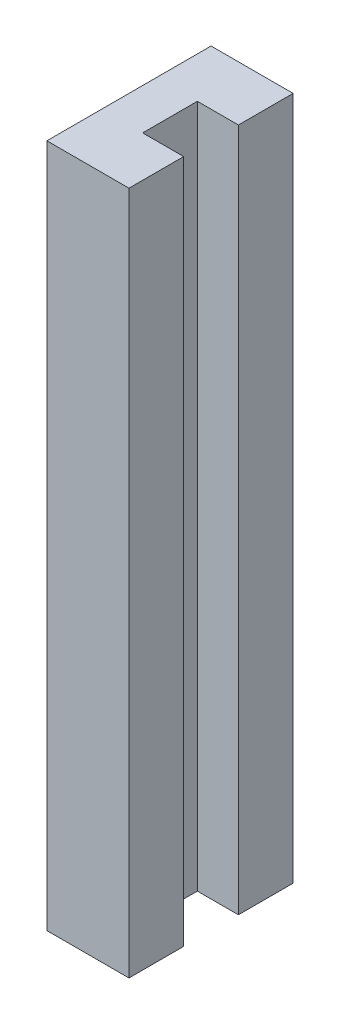
ISO-10303-21;
HEADER;
FILE_DESCRIPTION(('STEP AP214'),'2;1');
FILE_NAME('part.step','',(''),(''),'','','');
FILE_SCHEMA(('AUTOMOTIVE_DESIGN { 1 0 10303 214 1 1 1 1 }'));
ENDSEC;
DATA;
#1=APPLICATION_CONTEXT('core data for automotive mechanical design processes');
#2=APPLICATION_PROTOCOL_DEFINITION('international standard','automotive_design',2000,#1);
#3=PRODUCT_CONTEXT('',#1,'mechanical');
#4=PRODUCT('Part','Part','',(#3));
#5=PRODUCT_RELATED_PRODUCT_CATEGORY('part','',(#4));
#6=PRODUCT_DEFINITION_FORMATION('','',#4);
#7=PRODUCT_DEFINITION_CONTEXT('part definition',#1,'design');
#8=PRODUCT_DEFINITION('design','',#6,#7);
#9=PRODUCT_DEFINITION_SHAPE('','',#8);
#10=(LENGTH_UNIT() NAMED_UNIT(*) SI_UNIT(.MILLI.,.METRE.));
#11=(NAMED_UNIT(*) PLANE_ANGLE_UNIT() SI_UNIT($,.RADIAN.));
#12=(NAMED_UNIT(*) SI_UNIT($,.STERADIAN.) SOLID_ANGLE_UNIT());
#13=UNCERTAINTY_MEASURE_WITH_UNIT(LENGTH_MEASURE(1.E-05),#10,'distance_accuracy_value','');
#14=(GEOMETRIC_REPRESENTATION_CONTEXT(3) GLOBAL_UNCERTAINTY_ASSIGNED_CONTEXT((#13)) GLOBAL_UNIT_ASSIGNED_CONTEXT((#10,
#11,#12)) REPRESENTATION_CONTEXT('',''));
#15=CARTESIAN_POINT('',(0.,0.,0.));
#16=DIRECTION('',(0.,0.,1.));
#17=DIRECTION('',(1.,0.,0.));
#18=AXIS2_PLACEMENT_3D('',#15,#16,#17);
#19=CARTESIAN_POINT('',(0.,50.,0.));
#20=DIRECTION('',(0.,0.,1.));
#21=DIRECTION('',(1.,0.,0.));
#22=AXIS2_PLACEMENT_3D('',#19,#20,#21);
#23=PLANE('',#22);
#24=DIRECTION('',(-1.,0.,0.));
#25=VECTOR('',#24,1.);
#26=CARTESIAN_POINT('',(0.,0.,0.));
#27=LINE('',#26,#25);
#28=CARTESIAN_POINT('',(6.,0.,0.));
#29=VERTEX_POINT('',#28);
#30=CARTESIAN_POINT('',(0.,0.,0.));
#31=VERTEX_POINT('',#30);
#32=EDGE_CURVE('E129',#29,#31,#27,.T.);
#33=ORIENTED_EDGE('',*,*,#32,.T.);
#34=DIRECTION('',(0.,-1.,0.));
#35=VECTOR('',#34,1.);
#36=CARTESIAN_POINT('',(0.,50.,0.));
#37=LINE('',#36,#35);
#38=CARTESIAN_POINT('',(0.,50.,0.));
#39=VERTEX_POINT('',#38);
#40=EDGE_CURVE('E11',#39,#31,#37,.T.);
#41=ORIENTED_EDGE('',*,*,#40,.F.);
#42=DIRECTION('',(-1.,0.,0.));
#43=VECTOR('',#42,1.);
#44=CARTESIAN_POINT('',(0.,50.,0.));
#45=LINE('',#44,#43);
#46=CARTESIAN_POINT('',(6.,50.,0.));
#47=VERTEX_POINT('',#46);
#48=EDGE_CURVE('E143',#47,#39,#45,.T.);
#49=ORIENTED_EDGE('',*,*,#48,.F.);
#50=DIRECTION('',(0.,-1.,0.));
#51=VECTOR('',#50,1.);
#52=CARTESIAN_POINT('',(6.,50.,0.));
#53=LINE('',#52,#51);
#54=EDGE_CURVE('E125',#47,#29,#53,.T.);
#55=ORIENTED_EDGE('',*,*,#54,.T.);
#56=EDGE_LOOP('',(#33,#41,#49,#55));
#57=FACE_BOUND('',#56,.T.);
#58=ADVANCED_FACE('F33',(#57),#23,.F.);
#59=CARTESIAN_POINT('',(0.,50.,0.));
#60=DIRECTION('',(1.,0.,0.));
#61=DIRECTION('',(0.,0.,-1.));
#62=AXIS2_PLACEMENT_3D('',#59,#60,#61);
#63=PLANE('',#62);
#64=DIRECTION('',(0.,0.,1.));
#65=VECTOR('',#64,1.);
#66=CARTESIAN_POINT('',(0.,0.,0.));
#67=LINE('',#66,#65);
#68=CARTESIAN_POINT('',(0.,0.,12.));
#69=VERTEX_POINT('',#68);
#70=EDGE_CURVE('E132',#31,#69,#67,.T.);
#71=ORIENTED_EDGE('',*,*,#70,.T.);
#72=DIRECTION('',(0.,-1.,0.));
#73=VECTOR('',#72,1.);
#74=CARTESIAN_POINT('',(0.,50.,12.));
#75=LINE('',#74,#73);
#76=CARTESIAN_POINT('',(0.,50.,12.));
#77=VERTEX_POINT('',#76);
#78=EDGE_CURVE('E41',#77,#69,#75,.T.);
#79=ORIENTED_EDGE('',*,*,#78,.F.);
#80=DIRECTION('',(0.,0.,1.));
#81=VECTOR('',#80,1.);
#82=CARTESIAN_POINT('',(0.,50.,0.));
#83=LINE('',#82,#81);
#84=EDGE_CURVE('E92',#39,#77,#83,.T.);
#85=ORIENTED_EDGE('',*,*,#84,.F.);
#86=ORIENTED_EDGE('',*,*,#40,.T.);
#87=EDGE_LOOP('',(#71,#79,#85,#86));
#88=FACE_BOUND('',#87,.T.);
#89=ADVANCED_FACE('F178',(#88),#63,.F.);
#90=CARTESIAN_POINT('',(0.,50.,12.));
#91=DIRECTION('',(0.,0.,-1.));
#92=DIRECTION('',(-1.,0.,0.));
#93=AXIS2_PLACEMENT_3D('',#90,#91,#92);
#94=PLANE('',#93);
#95=DIRECTION('',(1.,0.,0.));
#96=VECTOR('',#95,1.);
#97=CARTESIAN_POINT('',(0.,0.,12.));
#98=LINE('',#97,#96);
#99=CARTESIAN_POINT('',(6.,0.,12.));
#100=VERTEX_POINT('',#99);
#101=EDGE_CURVE('E134',#69,#100,#98,.T.);
#102=ORIENTED_EDGE('',*,*,#101,.T.);
#103=DIRECTION('',(0.,-1.,0.));
#104=VECTOR('',#103,1.);
#105=CARTESIAN_POINT('',(6.,50.,12.));
#106=LINE('',#105,#104);
#107=CARTESIAN_POINT('',(6.,50.,12.));
#108=VERTEX_POINT('',#107);
#109=EDGE_CURVE('E150',#108,#100,#106,.T.);
#110=ORIENTED_EDGE('',*,*,#109,.F.);
#111=DIRECTION('',(1.,0.,0.));
#112=VECTOR('',#111,1.);
#113=CARTESIAN_POINT('',(0.,50.,12.));
#114=LINE('',#113,#112);
#115=EDGE_CURVE('E158',#77,#108,#114,.T.);
#116=ORIENTED_EDGE('',*,*,#115,.F.);
#117=ORIENTED_EDGE('',*,*,#78,.T.);
#118=EDGE_LOOP('',(#102,#110,#116,#117));
#119=FACE_BOUND('',#118,.T.);
#120=ADVANCED_FACE('F156',(#119),#94,.F.);
#121=CARTESIAN_POINT('',(6.,50.,12.));
#122=DIRECTION('',(-1.,0.,0.));
#123=DIRECTION('',(0.,0.,1.));
#124=AXIS2_PLACEMENT_3D('',#121,#122,#123);
#125=PLANE('',#124);
#126=DIRECTION('',(0.,0.,-1.));
#127=VECTOR('',#126,1.);
#128=CARTESIAN_POINT('',(6.,0.,12.));
#129=LINE('',#128,#127);
#130=CARTESIAN_POINT('',(6.,0.,8.));
#131=VERTEX_POINT('',#130);
#132=EDGE_CURVE('E136',#100,#131,#129,.T.);
#133=ORIENTED_EDGE('',*,*,#132,.T.);
#134=DIRECTION('',(0.,-1.,0.));
#135=VECTOR('',#134,1.);
#136=CARTESIAN_POINT('',(6.,50.,8.));
#137=LINE('',#136,#135);
#138=CARTESIAN_POINT('',(6.,50.,8.));
#139=VERTEX_POINT('',#138);
#140=EDGE_CURVE('E147',#139,#131,#137,.T.);
#141=ORIENTED_EDGE('',*,*,#140,.F.);
#142=DIRECTION('',(0.,0.,-1.));
#143=VECTOR('',#142,1.);
#144=CARTESIAN_POINT('',(6.,50.,12.));
#145=LINE('',#144,#143);
#146=EDGE_CURVE('E170',#108,#139,#145,.T.);
#147=ORIENTED_EDGE('',*,*,#146,.F.);
#148=ORIENTED_EDGE('',*,*,#109,.T.);
#149=EDGE_LOOP('',(#133,#141,#147,#148));
#150=FACE_BOUND('',#149,.T.);
#151=ADVANCED_FACE('F166',(#150),#125,.F.);
#152=CARTESIAN_POINT('',(6.,50.,8.));
#153=DIRECTION('',(0.,0.,1.));
#154=DIRECTION('',(1.,0.,0.));
#155=AXIS2_PLACEMENT_3D('',#152,#153,#154);
#156=PLANE('',#155);
#157=DIRECTION('',(-1.,0.,0.));
#158=VECTOR('',#157,1.);
#159=CARTESIAN_POINT('',(6.,0.,8.));
#160=LINE('',#159,#158);
#161=CARTESIAN_POINT('',(3.,0.,8.));
#162=VERTEX_POINT('',#161);
#163=EDGE_CURVE('E138',#131,#162,#160,.T.);
#164=ORIENTED_EDGE('',*,*,#163,.T.);
#165=DIRECTION('',(0.,-1.,0.));
#166=VECTOR('',#165,1.);
#167=CARTESIAN_POINT('',(3.,50.,8.));
#168=LINE('',#167,#166);
#169=CARTESIAN_POINT('',(3.,50.,8.));
#170=VERTEX_POINT('',#169);
#171=EDGE_CURVE('E120',#170,#162,#168,.T.);
#172=ORIENTED_EDGE('',*,*,#171,.F.);
#173=DIRECTION('',(-1.,0.,0.));
#174=VECTOR('',#173,1.);
#175=CARTESIAN_POINT('',(6.,50.,8.));
#176=LINE('',#175,#174);
#177=EDGE_CURVE('E111',#139,#170,#176,.T.);
#178=ORIENTED_EDGE('',*,*,#177,.F.);
#179=ORIENTED_EDGE('',*,*,#140,.T.);
#180=EDGE_LOOP('',(#164,#172,#178,#179));
#181=FACE_BOUND('',#180,.T.);
#182=ADVANCED_FACE('F169',(#181),#156,.F.);
#183=CARTESIAN_POINT('',(3.,50.,4.));
#184=DIRECTION('',(-1.,0.,0.));
#185=DIRECTION('',(0.,0.,1.));
#186=AXIS2_PLACEMENT_3D('',#183,#184,#185);
#187=PLANE('',#186);
#188=DIRECTION('',(0.,0.,-1.));
#189=VECTOR('',#188,1.);
#190=CARTESIAN_POINT('',(3.,0.,4.));
#191=LINE('',#190,#189);
#192=CARTESIAN_POINT('',(3.,0.,4.));
#193=VERTEX_POINT('',#192);
#194=EDGE_CURVE('E119',#162,#193,#191,.T.);
#195=ORIENTED_EDGE('',*,*,#194,.T.);
#196=DIRECTION('',(0.,-1.,0.));
#197=VECTOR('',#196,1.);
#198=CARTESIAN_POINT('',(3.,50.,4.));
#199=LINE('',#198,#197);
#200=CARTESIAN_POINT('',(3.,50.,4.));
#201=VERTEX_POINT('',#200);
#202=EDGE_CURVE('E116',#201,#193,#199,.T.);
#203=ORIENTED_EDGE('',*,*,#202,.F.);
#204=DIRECTION('',(0.,0.,-1.));
#205=VECTOR('',#204,1.);
#206=CARTESIAN_POINT('',(3.,50.,4.));
#207=LINE('',#206,#205);
#208=EDGE_CURVE('E105',#170,#201,#207,.T.);
#209=ORIENTED_EDGE('',*,*,#208,.F.);
#210=ORIENTED_EDGE('',*,*,#171,.T.);
#211=EDGE_LOOP('',(#195,#203,#209,#210));
#212=FACE_BOUND('',#211,.T.);
#213=ADVANCED_FACE('F117',(#212),#187,.F.);
#214=CARTESIAN_POINT('',(6.,50.,4.));
#215=DIRECTION('',(0.,0.,-1.));
#216=DIRECTION('',(-1.,0.,0.));
#217=AXIS2_PLACEMENT_3D('',#214,#215,#216);
#218=PLANE('',#217);
#219=DIRECTION('',(1.,0.,0.));
#220=VECTOR('',#219,1.);
#221=CARTESIAN_POINT('',(6.,0.,4.));
#222=LINE('',#221,#220);
#223=CARTESIAN_POINT('',(6.,0.,4.));
#224=VERTEX_POINT('',#223);
#225=EDGE_CURVE('E78',#193,#224,#222,.T.);
#226=ORIENTED_EDGE('',*,*,#225,.T.);
#227=DIRECTION('',(0.,-1.,0.));
#228=VECTOR('',#227,1.);
#229=CARTESIAN_POINT('',(6.,50.,4.));
#230=LINE('',#229,#228);
#231=CARTESIAN_POINT('',(6.,50.,4.));
#232=VERTEX_POINT('',#231);
#233=EDGE_CURVE('E121',#232,#224,#230,.T.);
#234=ORIENTED_EDGE('',*,*,#233,.F.);
#235=DIRECTION('',(1.,0.,0.));
#236=VECTOR('',#235,1.);
#237=CARTESIAN_POINT('',(6.,50.,4.));
#238=LINE('',#237,#236);
#239=EDGE_CURVE('E109',#201,#232,#238,.T.);
#240=ORIENTED_EDGE('',*,*,#239,.F.);
#241=ORIENTED_EDGE('',*,*,#202,.T.);
#242=EDGE_LOOP('',(#226,#234,#240,#241));
#243=FACE_BOUND('',#242,.T.);
#244=ADVANCED_FACE('F123',(#243),#218,.F.);
#245=CARTESIAN_POINT('',(6.,50.,0.));
#246=DIRECTION('',(-1.,0.,0.));
#247=DIRECTION('',(0.,0.,1.));
#248=AXIS2_PLACEMENT_3D('',#245,#246,#247);
#249=PLANE('',#248);
#250=DIRECTION('',(0.,0.,-1.));
#251=VECTOR('',#250,1.);
#252=CARTESIAN_POINT('',(6.,0.,0.));
#253=LINE('',#252,#251);
#254=EDGE_CURVE('E84',#224,#29,#253,.T.);
#255=ORIENTED_EDGE('',*,*,#254,.T.);
#256=ORIENTED_EDGE('',*,*,#54,.F.);
#257=DIRECTION('',(0.,0.,-1.));
#258=VECTOR('',#257,1.);
#259=CARTESIAN_POINT('',(6.,50.,0.));
#260=LINE('',#259,#258);
#261=EDGE_CURVE('E49',#232,#47,#260,.T.);
#262=ORIENTED_EDGE('',*,*,#261,.F.);
#263=ORIENTED_EDGE('',*,*,#233,.T.);
#264=EDGE_LOOP('',(#255,#256,#262,#263));
#265=FACE_BOUND('',#264,.T.);
#266=ADVANCED_FACE('F194',(#265),#249,.F.);
#267=CARTESIAN_POINT('',(0.,50.,0.));
#268=DIRECTION('',(0.,-1.,0.));
#269=DIRECTION('',(0.,0.,-1.));
#270=AXIS2_PLACEMENT_3D('',#267,#268,#269);
#271=PLANE('',#270);
#272=ORIENTED_EDGE('',*,*,#48,.T.);
#273=ORIENTED_EDGE('',*,*,#84,.T.);
#274=ORIENTED_EDGE('',*,*,#115,.T.);
#275=ORIENTED_EDGE('',*,*,#146,.T.);
#276=ORIENTED_EDGE('',*,*,#177,.T.);
#277=ORIENTED_EDGE('',*,*,#208,.T.);
#278=ORIENTED_EDGE('',*,*,#239,.T.);
#279=ORIENTED_EDGE('',*,*,#261,.T.);
#280=EDGE_LOOP('',(#272,#273,#274,#275,#276,#277,#278,#279));
#281=FACE_BOUND('',#280,.T.);
#282=ADVANCED_FACE('F107',(#281),#271,.F.);
#283=CARTESIAN_POINT('',(0.,0.,0.));
#284=DIRECTION('',(0.,-1.,0.));
#285=DIRECTION('',(0.,0.,-1.));
#286=AXIS2_PLACEMENT_3D('',#283,#284,#285);
#287=PLANE('',#286);
#288=ORIENTED_EDGE('',*,*,#32,.F.);
#289=ORIENTED_EDGE('',*,*,#254,.F.);
#290=ORIENTED_EDGE('',*,*,#225,.F.);
#291=ORIENTED_EDGE('',*,*,#194,.F.);
#292=ORIENTED_EDGE('',*,*,#163,.F.);
#293=ORIENTED_EDGE('',*,*,#132,.F.);
#294=ORIENTED_EDGE('',*,*,#101,.F.);
#295=ORIENTED_EDGE('',*,*,#70,.F.);
#296=EDGE_LOOP('',(#288,#289,#290,#291,#292,#293,#294,#295));
#297=FACE_BOUND('',#296,.T.);
#298=ADVANCED_FACE('F162',(#297),#287,.T.);
#299=CLOSED_SHELL('',(#58,#89,#120,#151,#182,#213,#244,#266,#282,#298));
#300=MANIFOLD_SOLID_BREP('B2',#299);
#301=ADVANCED_BREP_SHAPE_REPRESENTATION('',(#18,#300),#14);
#302=SHAPE_DEFINITION_REPRESENTATION(#9,#301);
ENDSEC;
END-ISO-10303-21;
